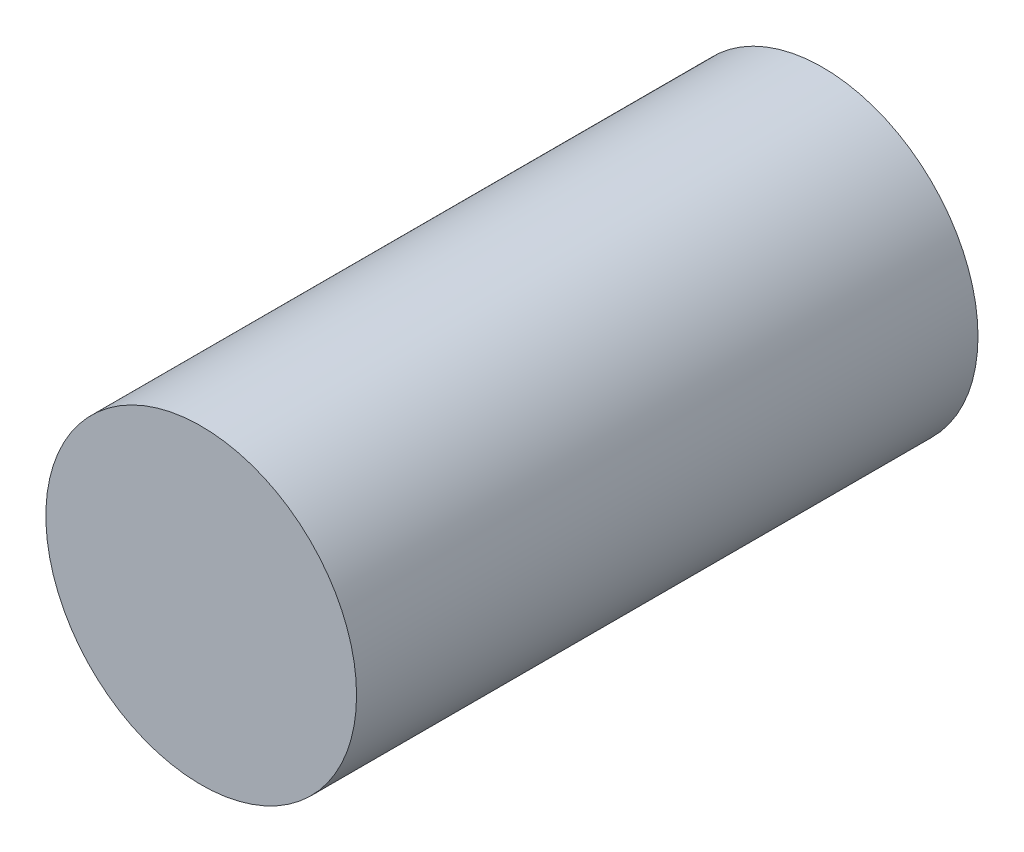
ISO-10303-21;
HEADER;
FILE_DESCRIPTION(('STEP AP214'),'2;1');
FILE_NAME('part.step','',(''),(''),'','','');
FILE_SCHEMA(('AUTOMOTIVE_DESIGN { 1 0 10303 214 1 1 1 1 }'));
ENDSEC;
DATA;
#1=APPLICATION_CONTEXT('core data for automotive mechanical design processes');
#2=APPLICATION_PROTOCOL_DEFINITION('international standard','automotive_design',2000,#1);
#3=PRODUCT_CONTEXT('',#1,'mechanical');
#4=PRODUCT('Part','Part','',(#3));
#5=PRODUCT_RELATED_PRODUCT_CATEGORY('part','',(#4));
#6=PRODUCT_DEFINITION_FORMATION('','',#4);
#7=PRODUCT_DEFINITION_CONTEXT('part definition',#1,'design');
#8=PRODUCT_DEFINITION('design','',#6,#7);
#9=PRODUCT_DEFINITION_SHAPE('','',#8);
#10=(LENGTH_UNIT() NAMED_UNIT(*) SI_UNIT(.MILLI.,.METRE.));
#11=(NAMED_UNIT(*) PLANE_ANGLE_UNIT() SI_UNIT($,.RADIAN.));
#12=(NAMED_UNIT(*) SI_UNIT($,.STERADIAN.) SOLID_ANGLE_UNIT());
#13=UNCERTAINTY_MEASURE_WITH_UNIT(LENGTH_MEASURE(1.E-05),#10,'distance_accuracy_value','');
#14=(GEOMETRIC_REPRESENTATION_CONTEXT(3) GLOBAL_UNCERTAINTY_ASSIGNED_CONTEXT((#13)) GLOBAL_UNIT_ASSIGNED_CONTEXT((#10,
#11,#12)) REPRESENTATION_CONTEXT('',''));
#15=CARTESIAN_POINT('',(0.,0.,0.));
#16=DIRECTION('',(0.,0.,1.));
#17=DIRECTION('',(1.,0.,0.));
#18=AXIS2_PLACEMENT_3D('',#15,#16,#17);
#19=CARTESIAN_POINT('',(0.,0.,2.54));
#20=DIRECTION('',(0.,0.,-1.));
#21=DIRECTION('',(-1.,0.,0.));
#22=AXIS2_PLACEMENT_3D('',#19,#20,#21);
#23=CYLINDRICAL_SURFACE('',#22,1.27);
#24=CARTESIAN_POINT('',(0.,0.,2.54));
#25=DIRECTION('',(0.,0.,1.));
#26=DIRECTION('',(1.,0.,0.));
#27=AXIS2_PLACEMENT_3D('',#24,#25,#26);
#28=CIRCLE('',#27,1.27);
#29=CARTESIAN_POINT('',(1.27,0.,2.54));
#30=VERTEX_POINT('',#29);
#31=EDGE_CURVE('E10',#30,#30,#28,.T.);
#32=ORIENTED_EDGE('',*,*,#31,.F.);
#33=EDGE_LOOP('',(#32));
#34=FACE_BOUND('',#33,.T.);
#35=CARTESIAN_POINT('',(0.,0.,-2.54));
#36=DIRECTION('',(0.,0.,1.));
#37=DIRECTION('',(1.,0.,0.));
#38=AXIS2_PLACEMENT_3D('',#35,#36,#37);
#39=CIRCLE('',#38,1.27);
#40=CARTESIAN_POINT('',(1.27,0.,-2.54));
#41=VERTEX_POINT('',#40);
#42=EDGE_CURVE('E38',#41,#41,#39,.T.);
#43=ORIENTED_EDGE('',*,*,#42,.T.);
#44=EDGE_LOOP('',(#43));
#45=FACE_BOUND('',#44,.T.);
#46=ADVANCED_FACE('F35',(#34,#45),#23,.T.);
#47=CARTESIAN_POINT('',(0.,0.,2.54));
#48=DIRECTION('',(0.,0.,1.));
#49=DIRECTION('',(1.,0.,0.));
#50=AXIS2_PLACEMENT_3D('',#47,#48,#49);
#51=PLANE('',#50);
#52=ORIENTED_EDGE('',*,*,#31,.T.);
#53=EDGE_LOOP('',(#52));
#54=FACE_BOUND('',#53,.T.);
#55=ADVANCED_FACE('F50',(#54),#51,.T.);
#56=CARTESIAN_POINT('',(0.,0.,-2.54));
#57=DIRECTION('',(0.,0.,1.));
#58=DIRECTION('',(1.,0.,0.));
#59=AXIS2_PLACEMENT_3D('',#56,#57,#58);
#60=PLANE('',#59);
#61=ORIENTED_EDGE('',*,*,#42,.F.);
#62=EDGE_LOOP('',(#61));
#63=FACE_BOUND('',#62,.T.);
#64=ADVANCED_FACE('F48',(#63),#60,.F.);
#65=CLOSED_SHELL('',(#46,#55,#64));
#66=MANIFOLD_SOLID_BREP('B2',#65);
#67=ADVANCED_BREP_SHAPE_REPRESENTATION('',(#18,#66),#14);
#68=SHAPE_DEFINITION_REPRESENTATION(#9,#67);
ENDSEC;
END-ISO-10303-21;
